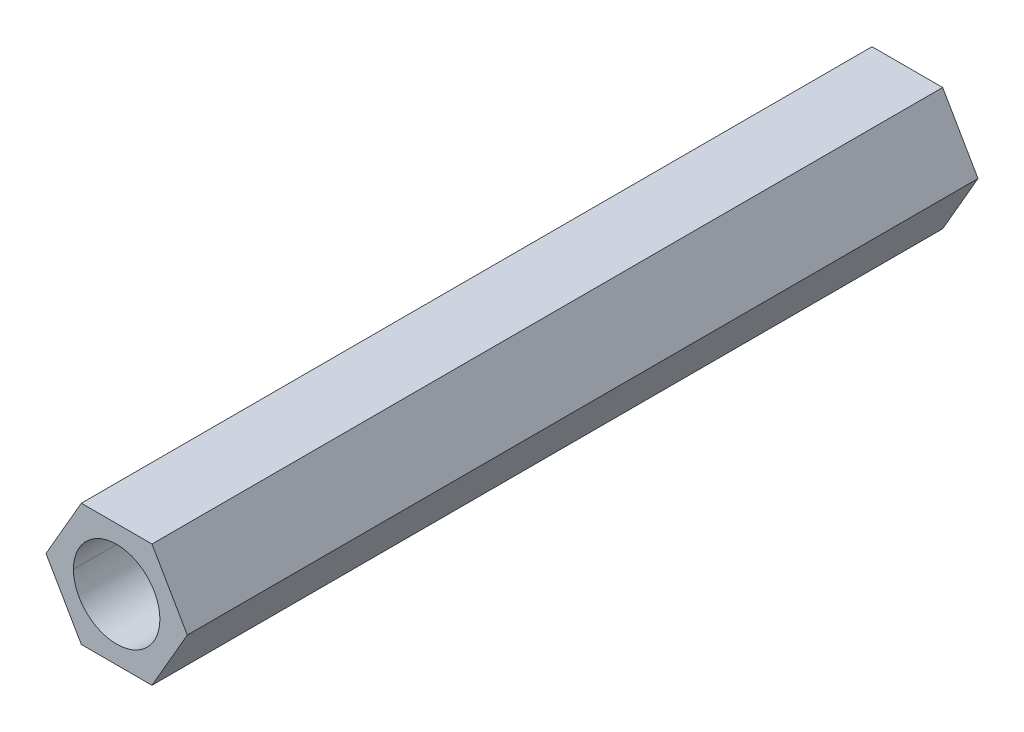
ISO-10303-21;
HEADER;
FILE_DESCRIPTION(('STEP AP214'),'2;1');
FILE_NAME('part.step','',(''),(''),'','','');
FILE_SCHEMA(('AUTOMOTIVE_DESIGN { 1 0 10303 214 1 1 1 1 }'));
ENDSEC;
DATA;
#1=APPLICATION_CONTEXT('core data for automotive mechanical design processes');
#2=APPLICATION_PROTOCOL_DEFINITION('international standard','automotive_design',2000,#1);
#3=PRODUCT_CONTEXT('',#1,'mechanical');
#4=PRODUCT('Part','Part','',(#3));
#5=PRODUCT_RELATED_PRODUCT_CATEGORY('part','',(#4));
#6=PRODUCT_DEFINITION_FORMATION('','',#4);
#7=PRODUCT_DEFINITION_CONTEXT('part definition',#1,'design');
#8=PRODUCT_DEFINITION('design','',#6,#7);
#9=PRODUCT_DEFINITION_SHAPE('','',#8);
#10=(LENGTH_UNIT() NAMED_UNIT(*) SI_UNIT(.MILLI.,.METRE.));
#11=(NAMED_UNIT(*) PLANE_ANGLE_UNIT() SI_UNIT($,.RADIAN.));
#12=(NAMED_UNIT(*) SI_UNIT($,.STERADIAN.) SOLID_ANGLE_UNIT());
#13=UNCERTAINTY_MEASURE_WITH_UNIT(LENGTH_MEASURE(1.E-05),#10,'distance_accuracy_value','');
#14=(GEOMETRIC_REPRESENTATION_CONTEXT(3) GLOBAL_UNCERTAINTY_ASSIGNED_CONTEXT((#13)) GLOBAL_UNIT_ASSIGNED_CONTEXT((#10,
#11,#12)) REPRESENTATION_CONTEXT('',''));
#15=CARTESIAN_POINT('',(0.,0.,0.));
#16=DIRECTION('',(0.,0.,1.));
#17=DIRECTION('',(1.,0.,0.));
#18=AXIS2_PLACEMENT_3D('',#15,#16,#17);
#19=CARTESIAN_POINT('',(272.289582092673,-111.574756673886,51.1845553956461));
#20=DIRECTION('',(0.,0.,1.));
#21=DIRECTION('',(1.,0.,0.));
#22=AXIS2_PLACEMENT_3D('',#19,#20,#21);
#23=CYLINDRICAL_SURFACE('',#22,1.36664292310121);
#24=CARTESIAN_POINT('',(270.922939169571,-111.574756673886,38.6845553956461));
#25=CARTESIAN_POINT('',(270.922939169571,-111.574756673886,63.6845553956461));
#26=(BOUNDED_CURVE() B_SPLINE_CURVE(1,(#24,#25),.UNSPECIFIED.,.F.,
.F.) B_SPLINE_CURVE_WITH_KNOTS((2,2),(0.,25.),
.UNSPECIFIED.) CURVE() GEOMETRIC_REPRESENTATION_ITEM() RATIONAL_B_SPLINE_CURVE((1.,1.)) REPRESENTATION_ITEM(''));
#27=CARTESIAN_POINT('',(270.922939169571,-111.574756673886,38.6845553956461));
#28=VERTEX_POINT('',#27);
#29=CARTESIAN_POINT('',(270.922939169572,-111.574756673886,63.6845553956461));
#30=VERTEX_POINT('',#29);
#31=EDGE_CURVE('E61',#28,#30,#26,.T.);
#32=ORIENTED_EDGE('',*,*,#31,.T.);
#33=CARTESIAN_POINT('',(272.289582092673,-111.574756673886,63.6845553956461));
#34=DIRECTION('',(0.,0.,-1.));
#35=DIRECTION('',(1.,0.,0.));
#36=AXIS2_PLACEMENT_3D('',#33,#34,#35);
#37=CIRCLE('',#36,1.36664292310127);
#38=CARTESIAN_POINT('',(273.656225015774,-111.574756673886,63.6845553956461));
#39=VERTEX_POINT('',#38);
#40=EDGE_CURVE('E11',#39,#30,#37,.T.);
#41=ORIENTED_EDGE('',*,*,#40,.F.);
#42=CARTESIAN_POINT('',(273.656225015774,-111.574756673886,38.6845553956461));
#43=CARTESIAN_POINT('',(273.656225015774,-111.574756673886,63.6845553956461));
#44=(BOUNDED_CURVE() B_SPLINE_CURVE(1,(#42,#43),.UNSPECIFIED.,.F.,
.F.) B_SPLINE_CURVE_WITH_KNOTS((2,2),(0.,25.),
.UNSPECIFIED.) CURVE() GEOMETRIC_REPRESENTATION_ITEM() RATIONAL_B_SPLINE_CURVE((1.,1.)) REPRESENTATION_ITEM(''));
#45=CARTESIAN_POINT('',(273.656225015774,-111.574756673886,38.6845553956461));
#46=VERTEX_POINT('',#45);
#47=EDGE_CURVE('E264',#46,#39,#44,.T.);
#48=ORIENTED_EDGE('',*,*,#47,.F.);
#49=CARTESIAN_POINT('',(272.289582092673,-111.574756673886,38.6845553956461));
#50=DIRECTION('',(0.,0.,-1.));
#51=DIRECTION('',(1.,0.,0.));
#52=AXIS2_PLACEMENT_3D('',#49,#50,#51);
#53=CIRCLE('',#52,1.36664292310121);
#54=EDGE_CURVE('E193',#46,#28,#53,.T.);
#55=ORIENTED_EDGE('',*,*,#54,.T.);
#56=EDGE_LOOP('',(#32,#41,#48,#55));
#57=FACE_BOUND('',#56,.T.);
#58=ADVANCED_FACE('F51',(#57),#23,.F.);
#59=CARTESIAN_POINT('',(269.497167768664,-113.993058416369,63.6845553956461));
#60=DIRECTION('',(0.,0.,1.));
#61=DIRECTION('',(1.,0.,0.));
#62=AXIS2_PLACEMENT_3D('',#59,#60,#61);
#63=PLANE('',#62);
#64=ORIENTED_EDGE('',*,*,#40,.T.);
#65=CARTESIAN_POINT('',(272.289582092673,-111.574756673886,63.6845553956461));
#66=DIRECTION('',(0.,0.,-1.));
#67=DIRECTION('',(-1.,0.,0.));
#68=AXIS2_PLACEMENT_3D('',#65,#66,#67);
#69=CIRCLE('',#68,1.36664292310127);
#70=EDGE_CURVE('E273',#30,#39,#69,.T.);
#71=ORIENTED_EDGE('',*,*,#70,.T.);
#72=EDGE_LOOP('',(#64,#71));
#73=FACE_BOUND('',#72,.T.);
#74=CARTESIAN_POINT('',(271.172616363069,-109.6401152799,63.6845553956461));
#75=CARTESIAN_POINT('',(270.055650633466,-111.574756673886,63.6845553956461));
#76=(BOUNDED_CURVE() B_SPLINE_CURVE(1,(#74,#75),.UNSPECIFIED.,.F.,
.F.) B_SPLINE_CURVE_WITH_KNOTS((2,2),(0.,3.26922478643855),
.UNSPECIFIED.) CURVE() GEOMETRIC_REPRESENTATION_ITEM() RATIONAL_B_SPLINE_CURVE((1.,1.)) REPRESENTATION_ITEM(''));
#77=CARTESIAN_POINT('',(271.172616363069,-109.6401152799,63.6845553956461));
#78=VERTEX_POINT('',#77);
#79=CARTESIAN_POINT('',(270.055650633466,-111.574756673886,63.6845553956461));
#80=VERTEX_POINT('',#79);
#81=EDGE_CURVE('E152',#78,#80,#76,.T.);
#82=ORIENTED_EDGE('',*,*,#81,.T.);
#83=CARTESIAN_POINT('',(270.055650633466,-111.574756673886,63.6845553956461));
#84=CARTESIAN_POINT('',(271.172616363069,-113.509398067873,63.6845553956461));
#85=(BOUNDED_CURVE() B_SPLINE_CURVE(1,(#83,#84),.UNSPECIFIED.,.F.,
.F.) B_SPLINE_CURVE_WITH_KNOTS((2,2),(3.26922478643855,6.5384495728771),
.UNSPECIFIED.) CURVE() GEOMETRIC_REPRESENTATION_ITEM() RATIONAL_B_SPLINE_CURVE((1.,1.)) REPRESENTATION_ITEM(''));
#86=CARTESIAN_POINT('',(271.172616363069,-113.509398067873,63.6845553956461));
#87=VERTEX_POINT('',#86);
#88=EDGE_CURVE('E149',#80,#87,#85,.T.);
#89=ORIENTED_EDGE('',*,*,#88,.T.);
#90=CARTESIAN_POINT('',(271.172616363069,-113.509398067873,63.6845553956461));
#91=CARTESIAN_POINT('',(273.406547822276,-113.509398067873,63.6845553956461));
#92=(BOUNDED_CURVE() B_SPLINE_CURVE(1,(#90,#91),.UNSPECIFIED.,.F.,
.F.) B_SPLINE_CURVE_WITH_KNOTS((2,2),(6.5384495728771,9.80767435931558),
.UNSPECIFIED.) CURVE() GEOMETRIC_REPRESENTATION_ITEM() RATIONAL_B_SPLINE_CURVE((1.,1.)) REPRESENTATION_ITEM(''));
#93=CARTESIAN_POINT('',(273.406547822276,-113.509398067873,63.6845553956461));
#94=VERTEX_POINT('',#93);
#95=EDGE_CURVE('E136',#87,#94,#92,.T.);
#96=ORIENTED_EDGE('',*,*,#95,.T.);
#97=CARTESIAN_POINT('',(273.406547822276,-113.509398067873,63.6845553956461));
#98=CARTESIAN_POINT('',(274.523513551879,-111.574756673886,63.6845553956461));
#99=(BOUNDED_CURVE() B_SPLINE_CURVE(1,(#97,#98),.UNSPECIFIED.,.F.,
.F.) B_SPLINE_CURVE_WITH_KNOTS((2,2),(9.80767435931558,13.0768991457541),
.UNSPECIFIED.) CURVE() GEOMETRIC_REPRESENTATION_ITEM() RATIONAL_B_SPLINE_CURVE((1.,1.)) REPRESENTATION_ITEM(''));
#100=CARTESIAN_POINT('',(274.523513551879,-111.574756673886,63.6845553956461));
#101=VERTEX_POINT('',#100);
#102=EDGE_CURVE('E234',#94,#101,#99,.T.);
#103=ORIENTED_EDGE('',*,*,#102,.T.);
#104=CARTESIAN_POINT('',(274.523513551879,-111.574756673886,63.6845553956461));
#105=CARTESIAN_POINT('',(273.406547822276,-109.6401152799,63.6845553956461));
#106=(BOUNDED_CURVE() B_SPLINE_CURVE(1,(#104,#105),.UNSPECIFIED.,.F.,
.F.) B_SPLINE_CURVE_WITH_KNOTS((2,2),(13.0768991457541,16.3461239321927),
.UNSPECIFIED.) CURVE() GEOMETRIC_REPRESENTATION_ITEM() RATIONAL_B_SPLINE_CURVE((1.,1.)) REPRESENTATION_ITEM(''));
#107=CARTESIAN_POINT('',(273.406547822276,-109.6401152799,63.6845553956461));
#108=VERTEX_POINT('',#107);
#109=EDGE_CURVE('E126',#101,#108,#106,.T.);
#110=ORIENTED_EDGE('',*,*,#109,.T.);
#111=CARTESIAN_POINT('',(273.406547822276,-109.6401152799,63.6845553956461));
#112=CARTESIAN_POINT('',(271.172616363069,-109.6401152799,63.6845553956461));
#113=(BOUNDED_CURVE() B_SPLINE_CURVE(1,(#111,#112),.UNSPECIFIED.,.F.,
.F.) B_SPLINE_CURVE_WITH_KNOTS((2,2),(16.3461239321927,19.6153487186312),
.UNSPECIFIED.) CURVE() GEOMETRIC_REPRESENTATION_ITEM() RATIONAL_B_SPLINE_CURVE((1.,1.)) REPRESENTATION_ITEM(''));
#114=EDGE_CURVE('E115',#108,#78,#113,.T.);
#115=ORIENTED_EDGE('',*,*,#114,.T.);
#116=EDGE_LOOP('',(#82,#89,#96,#103,#110,#115));
#117=FACE_BOUND('',#116,.T.);
#118=ADVANCED_FACE('F150',(#73,#117),#63,.T.);
#119=CARTESIAN_POINT('',(272.289582092673,-111.574756673886,51.1845553956461));
#120=DIRECTION('',(0.,0.,1.));
#121=DIRECTION('',(1.,0.,0.));
#122=AXIS2_PLACEMENT_3D('',#119,#120,#121);
#123=CYLINDRICAL_SURFACE('',#122,1.36664292310127);
#124=CARTESIAN_POINT('',(272.289582092673,-111.574756673886,38.6845553956461));
#125=DIRECTION('',(0.,0.,-1.));
#126=DIRECTION('',(-1.,0.,0.));
#127=AXIS2_PLACEMENT_3D('',#124,#125,#126);
#128=CIRCLE('',#127,1.36664292310121);
#129=EDGE_CURVE('E184',#28,#46,#128,.T.);
#130=ORIENTED_EDGE('',*,*,#129,.T.);
#131=ORIENTED_EDGE('',*,*,#47,.T.);
#132=ORIENTED_EDGE('',*,*,#70,.F.);
#133=ORIENTED_EDGE('',*,*,#31,.F.);
#134=EDGE_LOOP('',(#130,#131,#132,#133));
#135=FACE_BOUND('',#134,.T.);
#136=ADVANCED_FACE('F291',(#135),#123,.F.);
#137=CARTESIAN_POINT('',(271.172616363069,-109.6401152799,38.6845553956461));
#138=DIRECTION('',(0.,1.,0.));
#139=DIRECTION('',(1.,0.,0.));
#140=AXIS2_PLACEMENT_3D('',#137,#138,#139);
#141=PLANE('',#140);
#142=CARTESIAN_POINT('',(271.172616363069,-109.6401152799,38.6845553956461));
#143=CARTESIAN_POINT('',(271.172616363069,-109.6401152799,63.6845553956461));
#144=(BOUNDED_CURVE() B_SPLINE_CURVE(1,(#142,#143),.UNSPECIFIED.,.F.,
.F.) B_SPLINE_CURVE_WITH_KNOTS((2,2),(0.,25.),
.UNSPECIFIED.) CURVE() GEOMETRIC_REPRESENTATION_ITEM() RATIONAL_B_SPLINE_CURVE((1.,1.)) REPRESENTATION_ITEM(''));
#145=CARTESIAN_POINT('',(271.172616363069,-109.6401152799,38.6845553956461));
#146=VERTEX_POINT('',#145);
#147=EDGE_CURVE('E162',#146,#78,#144,.T.);
#148=ORIENTED_EDGE('',*,*,#147,.T.);
#149=ORIENTED_EDGE('',*,*,#114,.F.);
#150=CARTESIAN_POINT('',(273.406547822276,-109.6401152799,63.6845553956461));
#151=CARTESIAN_POINT('',(273.406547822276,-109.6401152799,38.6845553956461));
#152=(BOUNDED_CURVE() B_SPLINE_CURVE(1,(#150,#151),.UNSPECIFIED.,.F.,
.F.) B_SPLINE_CURVE_WITH_KNOTS((2,2),(-25.,0.),
.UNSPECIFIED.) CURVE() GEOMETRIC_REPRESENTATION_ITEM() RATIONAL_B_SPLINE_CURVE((1.,1.)) REPRESENTATION_ITEM(''));
#153=CARTESIAN_POINT('',(273.406547822276,-109.6401152799,38.6845553956461));
#154=VERTEX_POINT('',#153);
#155=EDGE_CURVE('E242',#108,#154,#152,.T.);
#156=ORIENTED_EDGE('',*,*,#155,.T.);
#157=CARTESIAN_POINT('',(273.406547822276,-109.6401152799,38.6845553956461));
#158=CARTESIAN_POINT('',(271.172616363069,-109.6401152799,38.6845553956461));
#159=(BOUNDED_CURVE() B_SPLINE_CURVE(1,(#157,#158),.UNSPECIFIED.,.F.,
.F.) B_SPLINE_CURVE_WITH_KNOTS((2,2),(16.3461239321927,19.6153487186312),
.UNSPECIFIED.) CURVE() GEOMETRIC_REPRESENTATION_ITEM() RATIONAL_B_SPLINE_CURVE((1.,1.)) REPRESENTATION_ITEM(''));
#160=EDGE_CURVE('E416',#154,#146,#159,.T.);
#161=ORIENTED_EDGE('',*,*,#160,.T.);
#162=EDGE_LOOP('',(#148,#149,#156,#161));
#163=FACE_BOUND('',#162,.T.);
#164=ADVANCED_FACE('F53',(#163),#141,.T.);
#165=CARTESIAN_POINT('',(273.406547822276,-109.6401152799,38.6845553956461));
#166=DIRECTION('',(0.866025403784428,0.500000000000019,0.));
#167=DIRECTION('',(0.,0.,-1.));
#168=AXIS2_PLACEMENT_3D('',#165,#166,#167);
#169=PLANE('',#168);
#170=ORIENTED_EDGE('',*,*,#155,.F.);
#171=ORIENTED_EDGE('',*,*,#109,.F.);
#172=CARTESIAN_POINT('',(274.523513551879,-111.574756673886,63.6845553956461));
#173=CARTESIAN_POINT('',(274.523513551879,-111.574756673886,38.6845553956461));
#174=(BOUNDED_CURVE() B_SPLINE_CURVE(1,(#172,#173),.UNSPECIFIED.,.F.,
.F.) B_SPLINE_CURVE_WITH_KNOTS((2,2),(-25.,0.),
.UNSPECIFIED.) CURVE() GEOMETRIC_REPRESENTATION_ITEM() RATIONAL_B_SPLINE_CURVE((1.,1.)) REPRESENTATION_ITEM(''));
#175=CARTESIAN_POINT('',(274.523513551879,-111.574756673886,38.6845553956461));
#176=VERTEX_POINT('',#175);
#177=EDGE_CURVE('E146',#101,#176,#174,.T.);
#178=ORIENTED_EDGE('',*,*,#177,.T.);
#179=CARTESIAN_POINT('',(274.523513551879,-111.574756673886,38.6845553956461));
#180=CARTESIAN_POINT('',(273.406547822276,-109.6401152799,38.6845553956461));
#181=(BOUNDED_CURVE() B_SPLINE_CURVE(1,(#179,#180),.UNSPECIFIED.,.F.,
.F.) B_SPLINE_CURVE_WITH_KNOTS((2,2),(13.0768991457541,16.3461239321927),
.UNSPECIFIED.) CURVE() GEOMETRIC_REPRESENTATION_ITEM() RATIONAL_B_SPLINE_CURVE((1.,1.)) REPRESENTATION_ITEM(''));
#182=EDGE_CURVE('E408',#176,#154,#181,.T.);
#183=ORIENTED_EDGE('',*,*,#182,.T.);
#184=EDGE_LOOP('',(#170,#171,#178,#183));
#185=FACE_BOUND('',#184,.T.);
#186=ADVANCED_FACE('F301',(#185),#169,.T.);
#187=CARTESIAN_POINT('',(274.523513551879,-111.574756673886,38.6845553956461));
#188=DIRECTION('',(0.86602540378443,-0.500000000000015,0.));
#189=DIRECTION('',(0.,0.,-1.));
#190=AXIS2_PLACEMENT_3D('',#187,#188,#189);
#191=PLANE('',#190);
#192=ORIENTED_EDGE('',*,*,#177,.F.);
#193=ORIENTED_EDGE('',*,*,#102,.F.);
#194=CARTESIAN_POINT('',(273.406547822276,-113.509398067873,63.6845553956461));
#195=CARTESIAN_POINT('',(273.406547822276,-113.509398067873,38.6845553956461));
#196=(BOUNDED_CURVE() B_SPLINE_CURVE(1,(#194,#195),.UNSPECIFIED.,.F.,
.F.) B_SPLINE_CURVE_WITH_KNOTS((2,2),(-25.,0.),
.UNSPECIFIED.) CURVE() GEOMETRIC_REPRESENTATION_ITEM() RATIONAL_B_SPLINE_CURVE((1.,1.)) REPRESENTATION_ITEM(''));
#197=CARTESIAN_POINT('',(273.406547822276,-113.509398067873,38.6845553956461));
#198=VERTEX_POINT('',#197);
#199=EDGE_CURVE('E143',#94,#198,#196,.T.);
#200=ORIENTED_EDGE('',*,*,#199,.T.);
#201=CARTESIAN_POINT('',(273.406547822276,-113.509398067873,38.6845553956461));
#202=CARTESIAN_POINT('',(274.523513551879,-111.574756673886,38.6845553956461));
#203=(BOUNDED_CURVE() B_SPLINE_CURVE(1,(#201,#202),.UNSPECIFIED.,.F.,
.F.) B_SPLINE_CURVE_WITH_KNOTS((2,2),(9.80767435931558,13.0768991457541),
.UNSPECIFIED.) CURVE() GEOMETRIC_REPRESENTATION_ITEM() RATIONAL_B_SPLINE_CURVE((1.,1.)) REPRESENTATION_ITEM(''));
#204=EDGE_CURVE('E411',#198,#176,#203,.T.);
#205=ORIENTED_EDGE('',*,*,#204,.T.);
#206=EDGE_LOOP('',(#192,#193,#200,#205));
#207=FACE_BOUND('',#206,.T.);
#208=ADVANCED_FACE('F304',(#207),#191,.T.);
#209=CARTESIAN_POINT('',(273.406547822276,-113.509398067873,38.6845553956461));
#210=DIRECTION('',(0.,-1.,0.));
#211=DIRECTION('',(0.,0.,-1.));
#212=AXIS2_PLACEMENT_3D('',#209,#210,#211);
#213=PLANE('',#212);
#214=ORIENTED_EDGE('',*,*,#199,.F.);
#215=ORIENTED_EDGE('',*,*,#95,.F.);
#216=CARTESIAN_POINT('',(271.172616363069,-113.509398067873,63.6845553956461));
#217=CARTESIAN_POINT('',(271.172616363069,-113.509398067873,38.6845553956461));
#218=(BOUNDED_CURVE() B_SPLINE_CURVE(1,(#216,#217),.UNSPECIFIED.,.F.,
.F.) B_SPLINE_CURVE_WITH_KNOTS((2,2),(-25.,0.),
.UNSPECIFIED.) CURVE() GEOMETRIC_REPRESENTATION_ITEM() RATIONAL_B_SPLINE_CURVE((1.,1.)) REPRESENTATION_ITEM(''));
#219=CARTESIAN_POINT('',(271.172616363069,-113.509398067873,38.6845553956461));
#220=VERTEX_POINT('',#219);
#221=EDGE_CURVE('E141',#87,#220,#218,.T.);
#222=ORIENTED_EDGE('',*,*,#221,.T.);
#223=CARTESIAN_POINT('',(271.172616363069,-113.509398067873,38.6845553956461));
#224=CARTESIAN_POINT('',(273.406547822276,-113.509398067873,38.6845553956461));
#225=(BOUNDED_CURVE() B_SPLINE_CURVE(1,(#223,#224),.UNSPECIFIED.,.F.,
.F.) B_SPLINE_CURVE_WITH_KNOTS((2,2),(6.5384495728771,9.80767435931558),
.UNSPECIFIED.) CURVE() GEOMETRIC_REPRESENTATION_ITEM() RATIONAL_B_SPLINE_CURVE((1.,1.)) REPRESENTATION_ITEM(''));
#226=EDGE_CURVE('E192',#220,#198,#225,.T.);
#227=ORIENTED_EDGE('',*,*,#226,.T.);
#228=EDGE_LOOP('',(#214,#215,#222,#227));
#229=FACE_BOUND('',#228,.T.);
#230=ADVANCED_FACE('F138',(#229),#213,.T.);
#231=CARTESIAN_POINT('',(271.172616363069,-113.509398067873,38.6845553956461));
#232=DIRECTION('',(-0.866025403784439,-0.5,0.));
#233=DIRECTION('',(-0.5,0.866025403784439,0.));
#234=AXIS2_PLACEMENT_3D('',#231,#232,#233);
#235=PLANE('',#234);
#236=ORIENTED_EDGE('',*,*,#221,.F.);
#237=ORIENTED_EDGE('',*,*,#88,.F.);
#238=CARTESIAN_POINT('',(270.055650633466,-111.574756673886,63.6845553956461));
#239=CARTESIAN_POINT('',(270.055650633466,-111.574756673886,38.6845553956461));
#240=(BOUNDED_CURVE() B_SPLINE_CURVE(1,(#238,#239),.UNSPECIFIED.,.F.,
.F.) B_SPLINE_CURVE_WITH_KNOTS((2,2),(-25.,0.),
.UNSPECIFIED.) CURVE() GEOMETRIC_REPRESENTATION_ITEM() RATIONAL_B_SPLINE_CURVE((1.,1.)) REPRESENTATION_ITEM(''));
#241=CARTESIAN_POINT('',(270.055650633466,-111.574756673886,38.6845553956461));
#242=VERTEX_POINT('',#241);
#243=EDGE_CURVE('E200',#80,#242,#240,.T.);
#244=ORIENTED_EDGE('',*,*,#243,.T.);
#245=CARTESIAN_POINT('',(270.055650633466,-111.574756673886,38.6845553956461));
#246=CARTESIAN_POINT('',(271.172616363069,-113.509398067873,38.6845553956461));
#247=(BOUNDED_CURVE() B_SPLINE_CURVE(1,(#245,#246),.UNSPECIFIED.,.F.,
.F.) B_SPLINE_CURVE_WITH_KNOTS((2,2),(3.26922478643855,6.5384495728771),
.UNSPECIFIED.) CURVE() GEOMETRIC_REPRESENTATION_ITEM() RATIONAL_B_SPLINE_CURVE((1.,1.)) REPRESENTATION_ITEM(''));
#248=EDGE_CURVE('E159',#242,#220,#247,.T.);
#249=ORIENTED_EDGE('',*,*,#248,.T.);
#250=EDGE_LOOP('',(#236,#237,#244,#249));
#251=FACE_BOUND('',#250,.T.);
#252=ADVANCED_FACE('F157',(#251),#235,.T.);
#253=CARTESIAN_POINT('',(270.055650633466,-111.574756673886,38.6845553956461));
#254=DIRECTION('',(-0.866025403784441,0.5,0.));
#255=DIRECTION('',(0.,0.,1.));
#256=AXIS2_PLACEMENT_3D('',#253,#254,#255);
#257=PLANE('',#256);
#258=ORIENTED_EDGE('',*,*,#243,.F.);
#259=ORIENTED_EDGE('',*,*,#81,.F.);
#260=ORIENTED_EDGE('',*,*,#147,.F.);
#261=CARTESIAN_POINT('',(271.172616363069,-109.6401152799,38.6845553956461));
#262=CARTESIAN_POINT('',(270.055650633466,-111.574756673886,38.6845553956461));
#263=(BOUNDED_CURVE() B_SPLINE_CURVE(1,(#261,#262),.UNSPECIFIED.,.F.,
.F.) B_SPLINE_CURVE_WITH_KNOTS((2,2),(0.,3.26922478643855),
.UNSPECIFIED.) CURVE() GEOMETRIC_REPRESENTATION_ITEM() RATIONAL_B_SPLINE_CURVE((1.,1.)) REPRESENTATION_ITEM(''));
#264=EDGE_CURVE('E176',#146,#242,#263,.T.);
#265=ORIENTED_EDGE('',*,*,#264,.T.);
#266=EDGE_LOOP('',(#258,#259,#260,#265));
#267=FACE_BOUND('',#266,.T.);
#268=ADVANCED_FACE('F310',(#267),#257,.T.);
#269=CARTESIAN_POINT('',(269.497167768664,-113.993058416369,38.6845553956461));
#270=DIRECTION('',(0.,0.,-1.));
#271=DIRECTION('',(0.,-1.,0.));
#272=AXIS2_PLACEMENT_3D('',#269,#270,#271);
#273=PLANE('',#272);
#274=ORIENTED_EDGE('',*,*,#129,.F.);
#275=ORIENTED_EDGE('',*,*,#54,.F.);
#276=EDGE_LOOP('',(#274,#275));
#277=FACE_BOUND('',#276,.T.);
#278=ORIENTED_EDGE('',*,*,#160,.F.);
#279=ORIENTED_EDGE('',*,*,#182,.F.);
#280=ORIENTED_EDGE('',*,*,#204,.F.);
#281=ORIENTED_EDGE('',*,*,#226,.F.);
#282=ORIENTED_EDGE('',*,*,#248,.F.);
#283=ORIENTED_EDGE('',*,*,#264,.F.);
#284=EDGE_LOOP('',(#278,#279,#280,#281,#282,#283));
#285=FACE_BOUND('',#284,.T.);
#286=ADVANCED_FACE('F313',(#277,#285),#273,.T.);
#287=CLOSED_SHELL('',(#58,#118,#136,#164,#186,#208,#230,#252,#268,#286));
#288=MANIFOLD_SOLID_BREP('B2',#287);
#289=ADVANCED_BREP_SHAPE_REPRESENTATION('',(#18,#288),#14);
#290=SHAPE_DEFINITION_REPRESENTATION(#9,#289);
ENDSEC;
END-ISO-10303-21;
